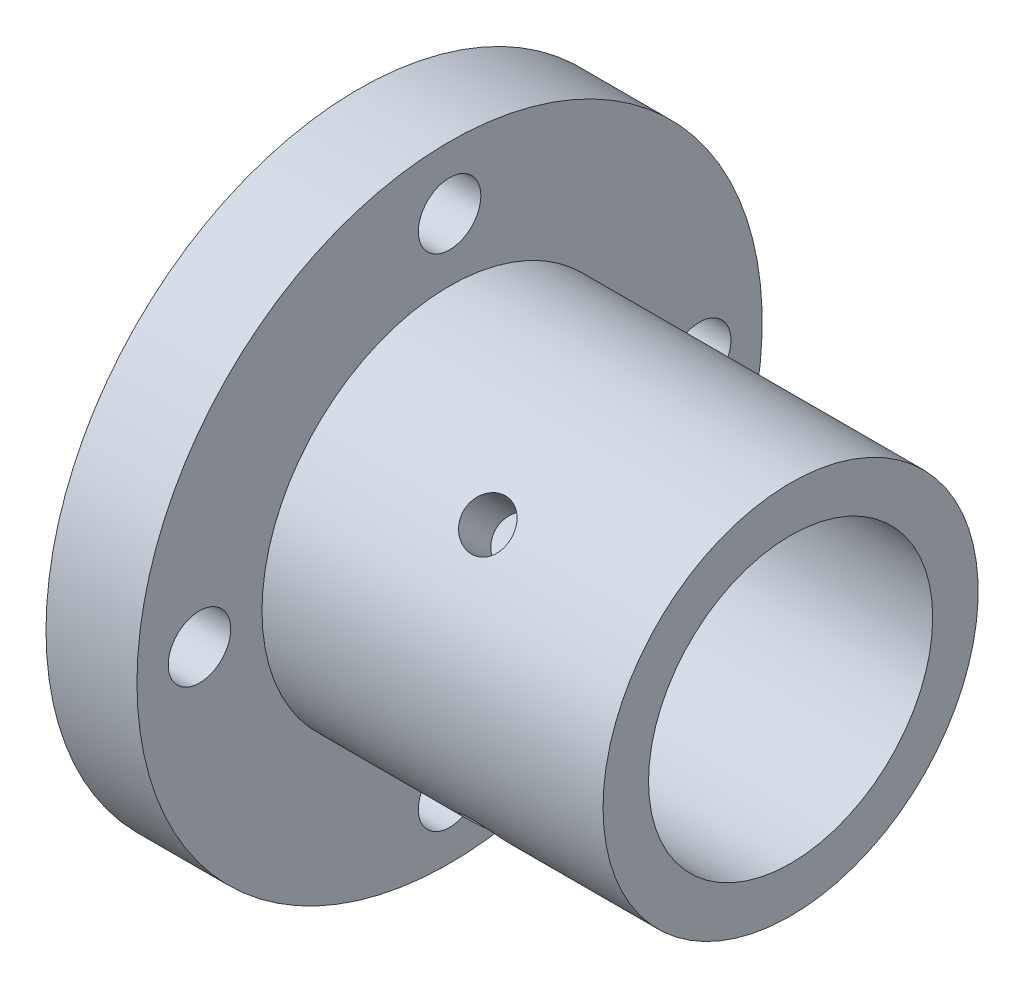
ISO-10303-21;
HEADER;
FILE_DESCRIPTION(('STEP AP214'),'2;1');
FILE_NAME('part.step','',(''),(''),'','','');
FILE_SCHEMA(('AUTOMOTIVE_DESIGN { 1 0 10303 214 1 1 1 1 }'));
ENDSEC;
DATA;
#1=APPLICATION_CONTEXT('core data for automotive mechanical design processes');
#2=APPLICATION_PROTOCOL_DEFINITION('international standard','automotive_design',2000,#1);
#3=PRODUCT_CONTEXT('',#1,'mechanical');
#4=PRODUCT('Part','Part','',(#3));
#5=PRODUCT_RELATED_PRODUCT_CATEGORY('part','',(#4));
#6=PRODUCT_DEFINITION_FORMATION('','',#4);
#7=PRODUCT_DEFINITION_CONTEXT('part definition',#1,'design');
#8=PRODUCT_DEFINITION('design','',#6,#7);
#9=PRODUCT_DEFINITION_SHAPE('','',#8);
#10=(LENGTH_UNIT() NAMED_UNIT(*) SI_UNIT(.MILLI.,.METRE.));
#11=(NAMED_UNIT(*) PLANE_ANGLE_UNIT() SI_UNIT($,.RADIAN.));
#12=(NAMED_UNIT(*) SI_UNIT($,.STERADIAN.) SOLID_ANGLE_UNIT());
#13=UNCERTAINTY_MEASURE_WITH_UNIT(LENGTH_MEASURE(1.E-05),#10,'distance_accuracy_value','');
#14=(GEOMETRIC_REPRESENTATION_CONTEXT(3) GLOBAL_UNCERTAINTY_ASSIGNED_CONTEXT((#13)) GLOBAL_UNIT_ASSIGNED_CONTEXT((#10,
#11,#12)) REPRESENTATION_CONTEXT('',''));
#15=CARTESIAN_POINT('',(0.,0.,0.));
#16=DIRECTION('',(0.,0.,1.));
#17=DIRECTION('',(1.,0.,0.));
#18=AXIS2_PLACEMENT_3D('',#15,#16,#17);
#19=CARTESIAN_POINT('',(8.,27.5,0.));
#20=DIRECTION('',(-1.,0.,0.));
#21=DIRECTION('',(0.,0.,1.));
#22=AXIS2_PLACEMENT_3D('',#19,#20,#21);
#23=PLANE('',#22);
#24=CARTESIAN_POINT('',(8.,0.,-22.));
#25=DIRECTION('',(1.,0.,0.));
#26=DIRECTION('',(0.,0.,-1.));
#27=AXIS2_PLACEMENT_3D('',#24,#25,#26);
#28=CIRCLE('',#27,2.75);
#29=CARTESIAN_POINT('',(8.,0.,-24.75));
#30=VERTEX_POINT('',#29);
#31=EDGE_CURVE('E181',#30,#30,#28,.T.);
#32=ORIENTED_EDGE('',*,*,#31,.F.);
#33=EDGE_LOOP('',(#32));
#34=FACE_BOUND('',#33,.T.);
#35=CARTESIAN_POINT('',(8.,22.,0.));
#36=DIRECTION('',(1.,0.,0.));
#37=DIRECTION('',(0.,0.,-1.));
#38=AXIS2_PLACEMENT_3D('',#35,#36,#37);
#39=CIRCLE('',#38,2.75);
#40=CARTESIAN_POINT('',(8.,22.,-2.75));
#41=VERTEX_POINT('',#40);
#42=EDGE_CURVE('E187',#41,#41,#39,.T.);
#43=ORIENTED_EDGE('',*,*,#42,.F.);
#44=EDGE_LOOP('',(#43));
#45=FACE_BOUND('',#44,.T.);
#46=CARTESIAN_POINT('',(8.,-22.,0.));
#47=DIRECTION('',(1.,0.,0.));
#48=DIRECTION('',(0.,0.,-1.));
#49=AXIS2_PLACEMENT_3D('',#46,#47,#48);
#50=CIRCLE('',#49,2.75);
#51=CARTESIAN_POINT('',(8.,-22.,-2.75));
#52=VERTEX_POINT('',#51);
#53=EDGE_CURVE('E142',#52,#52,#50,.T.);
#54=ORIENTED_EDGE('',*,*,#53,.F.);
#55=EDGE_LOOP('',(#54));
#56=FACE_BOUND('',#55,.T.);
#57=CARTESIAN_POINT('',(7.99999999999999,0.,0.));
#58=DIRECTION('',(-1.,0.,0.));
#59=DIRECTION('',(0.,0.,1.));
#60=AXIS2_PLACEMENT_3D('',#57,#58,#59);
#61=CIRCLE('',#60,27.5);
#62=CARTESIAN_POINT('',(7.99999999999999,0.,27.5));
#63=VERTEX_POINT('',#62);
#64=EDGE_CURVE('E57',#63,#63,#61,.T.);
#65=ORIENTED_EDGE('',*,*,#64,.F.);
#66=EDGE_LOOP('',(#65));
#67=FACE_BOUND('',#66,.T.);
#68=CARTESIAN_POINT('',(8.,0.,0.));
#69=DIRECTION('',(-1.,0.,0.));
#70=DIRECTION('',(0.,0.,1.));
#71=AXIS2_PLACEMENT_3D('',#68,#69,#70);
#72=CIRCLE('',#71,16.5);
#73=CARTESIAN_POINT('',(8.,0.,16.5));
#74=VERTEX_POINT('',#73);
#75=EDGE_CURVE('E61',#74,#74,#72,.T.);
#76=ORIENTED_EDGE('',*,*,#75,.T.);
#77=EDGE_LOOP('',(#76));
#78=FACE_BOUND('',#77,.T.);
#79=CARTESIAN_POINT('',(8.,0.,22.));
#80=DIRECTION('',(1.,0.,0.));
#81=DIRECTION('',(0.,0.,-1.));
#82=AXIS2_PLACEMENT_3D('',#79,#80,#81);
#83=CIRCLE('',#82,2.75);
#84=CARTESIAN_POINT('',(8.,0.,19.25));
#85=VERTEX_POINT('',#84);
#86=EDGE_CURVE('E178',#85,#85,#83,.T.);
#87=ORIENTED_EDGE('',*,*,#86,.F.);
#88=EDGE_LOOP('',(#87));
#89=FACE_BOUND('',#88,.T.);
#90=ADVANCED_FACE('F46',(#34,#45,#56,#67,#78,#89),#23,.F.);
#91=CARTESIAN_POINT('',(0.,0.,0.));
#92=DIRECTION('',(-1.,0.,0.));
#93=DIRECTION('',(0.,0.,1.));
#94=AXIS2_PLACEMENT_3D('',#91,#92,#93);
#95=CYLINDRICAL_SURFACE('',#94,12.5);
#96=CARTESIAN_POINT('',(23.,-10.1981326048085,7.22828412382502));
#97=CARTESIAN_POINT('',(23.1170613984795,-10.1981307886513,7.22828894439021));
#98=CARTESIAN_POINT('',(23.2341863798609,-10.1923802342487,7.23642113225539));
#99=CARTESIAN_POINT('',(23.4651490324188,-10.169440788203,7.2686209091172));
#100=CARTESIAN_POINT('',(23.5789835866218,-10.1522413993201,7.2927031223168));
#101=CARTESIAN_POINT('',(23.7999894591586,-10.1066463659208,7.35575981861834));
#102=CARTESIAN_POINT('',(23.9071662969402,-10.0782601429937,7.39472176910366));
#103=CARTESIAN_POINT('',(24.1119972720998,-10.0106771232393,7.48595696267677));
#104=CARTESIAN_POINT('',(24.2096524594021,-9.97148152015918,7.53822873582905));
#105=CARTESIAN_POINT('',(24.393657323366,-9.882425934325,7.65461033215918));
#106=CARTESIAN_POINT('',(24.4798978193338,-9.83247351229668,7.71882206404446));
#107=CARTESIAN_POINT('',(24.6376767535172,-9.72288925943752,7.85640784989948));
#108=CARTESIAN_POINT('',(24.7092143148789,-9.66325685169084,7.92978244990528));
#109=CARTESIAN_POINT('',(24.835966987701,-9.53497572844085,8.08358277969902));
#110=CARTESIAN_POINT('',(24.8910804057894,-9.46627449059911,8.16404859930772));
#111=CARTESIAN_POINT('',(24.9827665836649,-9.32157088286221,8.32888522787638));
#112=CARTESIAN_POINT('',(25.0193405681662,-9.24556899564229,8.41325577848803));
#113=CARTESIAN_POINT('',(25.072575520882,-9.08883315214333,8.58232303405472));
#114=CARTESIAN_POINT('',(25.0894199723059,-9.00815024308958,8.66700926462315));
#115=CARTESIAN_POINT('',(25.1032883318735,-8.84357818645449,8.83487040810208));
#116=CARTESIAN_POINT('',(25.1003136079088,-8.75968926054527,8.91804542491712));
#117=CARTESIAN_POINT('',(25.0747710060593,-8.59201984639649,9.07968199579344));
#118=CARTESIAN_POINT('',(25.0524005980241,-8.50824676209205,9.1581825592171));
#119=CARTESIAN_POINT('',(24.9890126695472,-8.34254271046818,9.3093807384565));
#120=CARTESIAN_POINT('',(24.9479945740585,-8.26061180003846,9.38207817523736));
#121=CARTESIAN_POINT('',(24.8482798677082,-8.10085139957571,9.52036934670341));
#122=CARTESIAN_POINT('',(24.7895020362658,-8.02304272525901,9.58592852116968));
#123=CARTESIAN_POINT('',(24.655995870961,-7.87454367489341,9.7082868465584));
#124=CARTESIAN_POINT('',(24.5812662259142,-7.80385388469569,9.76508527671632));
#125=CARTESIAN_POINT('',(24.4168829140222,-7.67124814220185,9.86960898324088));
#126=CARTESIAN_POINT('',(24.327056646426,-7.60945107691787,9.91721379374904));
#127=CARTESIAN_POINT('',(24.1356110841336,-7.49800424460658,10.0017418444876));
#128=CARTESIAN_POINT('',(24.0339916772532,-7.44835459314769,10.038664983095));
#129=CARTESIAN_POINT('',(23.8216464453553,-7.3631271811199,10.1013451382225));
#130=CARTESIAN_POINT('',(23.710910267532,-7.32756569257743,10.1270892460825));
#131=CARTESIAN_POINT('',(23.4835851454842,-7.2721007636902,10.1669921421692));
#132=CARTESIAN_POINT('',(23.3669967263997,-7.25219592108774,10.1811519679247));
#133=CARTESIAN_POINT('',(23.1327916780163,-7.22905723384539,10.1975944857706));
#134=CARTESIAN_POINT('',(23.0152046873147,-7.22562404858701,10.2000191997902));
#135=CARTESIAN_POINT('',(22.7810176456507,-7.23503755010784,10.1933440874258));
#136=CARTESIAN_POINT('',(22.6644175561098,-7.24788359753837,10.1842447136375));
#137=CARTESIAN_POINT('',(22.4362825493482,-7.28916093488283,10.1547409151728));
#138=CARTESIAN_POINT('',(22.3247198496611,-7.31749132933072,10.1344096678628));
#139=CARTESIAN_POINT('',(22.1089442159606,-7.38849304971209,10.0827618321064));
#140=CARTESIAN_POINT('',(22.0047317284302,-7.43116524592106,10.0514445770127));
#141=CARTESIAN_POINT('',(21.805541110434,-7.52962945134889,9.97789944844883));
#142=CARTESIAN_POINT('',(21.7106586041627,-7.58554059027008,9.93557213935256));
#143=CARTESIAN_POINT('',(21.5338103978566,-7.70814451988606,9.84075703863453));
#144=CARTESIAN_POINT('',(21.4518456223042,-7.77483808155444,9.78826852040468));
#145=CARTESIAN_POINT('',(21.3022768969961,-7.91736231626032,9.67335646977207));
#146=CARTESIAN_POINT('',(21.2348340054259,-7.99328216848431,9.61083373000827));
#147=CARTESIAN_POINT('',(21.1173521496442,-8.15101580153728,9.47742556884917));
#148=CARTESIAN_POINT('',(21.0673126155126,-8.23282938925396,9.4065404214054));
#149=CARTESIAN_POINT('',(20.9863079657756,-8.39920887884043,9.25827416088997));
#150=CARTESIAN_POINT('',(20.955258885335,-8.48376089886334,9.18092338710197));
#151=CARTESIAN_POINT('',(20.9128462840786,-8.6532257910783,9.02137556636279));
#152=CARTESIAN_POINT('',(20.9014811163435,-8.73813863248505,8.93917892545208));
#153=CARTESIAN_POINT('',(20.8988069529719,-8.90469884311415,8.77325421757246));
#154=CARTESIAN_POINT('',(20.9072530135796,-8.98637352953092,8.68955741769242));
#155=CARTESIAN_POINT('',(20.9434313472036,-9.14529930315565,8.52213745204472));
#156=CARTESIAN_POINT('',(20.9711635079681,-9.22255041610751,8.43841428643336));
#157=CARTESIAN_POINT('',(21.0450322588923,-9.37063901207321,8.27365640748477));
#158=CARTESIAN_POINT('',(21.0911477011268,-9.44148375041511,8.19261872042888));
#159=CARTESIAN_POINT('',(21.2004465722753,-9.57534429793883,8.03575923257141));
#160=CARTESIAN_POINT('',(21.2636308312426,-9.63835972616518,7.95993768565477));
#161=CARTESIAN_POINT('',(21.4061405861386,-9.75607884740122,7.81522487742565));
#162=CARTESIAN_POINT('',(21.4856453082066,-9.81067731856278,7.74642450015062));
#163=CARTESIAN_POINT('',(21.6581632499166,-9.90978488031153,7.61923105603618));
#164=CARTESIAN_POINT('',(21.751179629318,-9.95429160464808,7.56084043069592));
#165=CARTESIAN_POINT('',(21.9488762015525,-10.0328280900646,7.45631797960671));
#166=CARTESIAN_POINT('',(22.0536355573304,-10.0667801039038,7.4102774511091));
#167=CARTESIAN_POINT('',(22.2712703667515,-10.123266824564,7.33292454113278));
#168=CARTESIAN_POINT('',(22.38413761003,-10.1458129004363,7.30159749599369));
#169=CARTESIAN_POINT('',(22.5811985126134,-10.1743630253965,7.26173086402306));
#170=CARTESIAN_POINT('',(22.6642012225838,-10.1832694655342,7.24921574895908));
#171=CARTESIAN_POINT('',(22.8314583160049,-10.1951548538376,7.23249072079573));
#172=CARTESIAN_POINT('',(22.9157126760953,-10.1981339124901,7.22828065288972));
#173=CARTESIAN_POINT('',(23.,-10.1981326048085,7.22828412382502));
#174=B_SPLINE_CURVE_WITH_KNOTS('',3,(#96,#97,#98,#99,#100,#101,#102,#103,#104,#105,#106,#107,
#108,#109,#110,#111,#112,#113,#114,#115,#116,#117,#118,#119,#120,#121,#122,#123,#124,#125,#126,
#127,#128,#129,#130,#131,#132,#133,#134,#135,#136,#137,#138,#139,#140,#141,#142,#143,#144,#145,
#146,#147,#148,#149,#150,#151,#152,#153,#154,#155,#156,#157,#158,#159,#160,#161,#162,#163,#164,
#165,#166,#167,#168,#169,#170,#171,#172,#173),.UNSPECIFIED.,.T.,.F.,(4,2,2,2,2,2,2,2,2,2,2,2,2,
2,2,2,2,2,2,2,2,2,2,2,2,2,2,2,2,2,2,2,2,2,2,2,2,2,4),(0.,0.350875958145451,0.702074072387613,
1.05297703633846,1.40384126339609,1.75785040037218,2.11188064363101,2.46805944490096,
2.82421471394629,3.17703078298167,3.52982250139846,3.87906402811644,4.22831632528106,
4.57919067492619,4.93009387634909,5.28532233621946,5.64055417554106,5.99619512469853,
6.35180421792334,6.70309867118227,7.05437932817152,7.4033978775084,7.75243760948005,
8.10474624423454,8.45708008119898,8.81314042381343,9.16918910516888,9.52365194445036,
9.87808512500237,10.2281592743139,10.5782313860894,10.927901935583,11.2775894925505,
11.6313450994484,11.9851835672062,12.3415698589654,12.6976002135917,12.950244955607,
13.2028849882627),.UNSPECIFIED.);
#175=CARTESIAN_POINT('',(23.,-10.1981326048085,7.22828412382502));
#176=VERTEX_POINT('',#175);
#177=EDGE_CURVE('E141',#176,#176,#174,.T.);
#178=ORIENTED_EDGE('',*,*,#177,.T.);
#179=EDGE_LOOP('',(#178));
#180=FACE_BOUND('',#179,.T.);
#181=CARTESIAN_POINT('',(23.,7.22828412382505,10.1981326048085));
#182=CARTESIAN_POINT('',(23.1170613984795,7.22828894439024,10.1981307886513));
#183=CARTESIAN_POINT('',(23.2341863798609,7.23642113225543,10.1923802342487));
#184=CARTESIAN_POINT('',(23.4651490324188,7.26862090911723,10.169440788203));
#185=CARTESIAN_POINT('',(23.5789835866218,7.29270312231683,10.15224139932));
#186=CARTESIAN_POINT('',(23.7999894591586,7.35575981861837,10.1066463659207));
#187=CARTESIAN_POINT('',(23.9071662969402,7.39472176910369,10.0782601429937));
#188=CARTESIAN_POINT('',(24.1119972720998,7.4859569626768,10.0106771232393));
#189=CARTESIAN_POINT('',(24.2096524594021,7.53822873582908,9.97148152015916));
#190=CARTESIAN_POINT('',(24.393657323366,7.65461033215921,9.88242593432497));
#191=CARTESIAN_POINT('',(24.4798978193338,7.7188220640445,9.83247351229665));
#192=CARTESIAN_POINT('',(24.6376767535172,7.85640784989951,9.7228892594375));
#193=CARTESIAN_POINT('',(24.7092143148789,7.92978244990532,9.66325685169082));
#194=CARTESIAN_POINT('',(24.835966987701,8.08358277969905,9.53497572844083));
#195=CARTESIAN_POINT('',(24.8910804057894,8.16404859930775,9.46627449059909));
#196=CARTESIAN_POINT('',(24.9827665836649,8.32888522787641,9.32157088286218));
#197=CARTESIAN_POINT('',(25.0193405681662,8.41325577848806,9.24556899564227));
#198=CARTESIAN_POINT('',(25.072575520882,8.58232303405475,9.0888331521433));
#199=CARTESIAN_POINT('',(25.0894199723059,8.66700926462317,9.00815024308955));
#200=CARTESIAN_POINT('',(25.1032883318735,8.8348704081021,8.84357818645446));
#201=CARTESIAN_POINT('',(25.1003136079088,8.91804542491715,8.75968926054525));
#202=CARTESIAN_POINT('',(25.0747710060593,9.07968199579347,8.59201984639646));
#203=CARTESIAN_POINT('',(25.0524005980241,9.15818255921713,8.50824676209202));
#204=CARTESIAN_POINT('',(24.9890126695472,9.30938073845652,8.34254271046815));
#205=CARTESIAN_POINT('',(24.9479945740585,9.38207817523738,8.26061180003843));
#206=CARTESIAN_POINT('',(24.8482798677082,9.52036934670344,8.10085139957569));
#207=CARTESIAN_POINT('',(24.7895020362658,9.5859285211697,8.02304272525898));
#208=CARTESIAN_POINT('',(24.655995870961,9.70828684655843,7.87454367489338));
#209=CARTESIAN_POINT('',(24.5812662259142,9.76508527671634,7.80385388469566));
#210=CARTESIAN_POINT('',(24.4168829140222,9.86960898324091,7.67124814220182));
#211=CARTESIAN_POINT('',(24.327056646426,9.91721379374906,7.60945107691784));
#212=CARTESIAN_POINT('',(24.1356110841336,10.0017418444876,7.49800424460655));
#213=CARTESIAN_POINT('',(24.0339916772532,10.038664983095,7.44835459314765));
#214=CARTESIAN_POINT('',(23.8216464453553,10.1013451382225,7.36312718111986));
#215=CARTESIAN_POINT('',(23.710910267532,10.1270892460825,7.3275656925774));
#216=CARTESIAN_POINT('',(23.4835851454842,10.1669921421692,7.27210076369016));
#217=CARTESIAN_POINT('',(23.3669967263997,10.1811519679247,7.25219592108771));
#218=CARTESIAN_POINT('',(23.1327916780163,10.1975944857706,7.22905723384535));
#219=CARTESIAN_POINT('',(23.0152046873148,10.2000191997902,7.22562404858698));
#220=CARTESIAN_POINT('',(22.7810176456507,10.1933440874258,7.23503755010781));
#221=CARTESIAN_POINT('',(22.6644175561098,10.1842447136375,7.24788359753833));
#222=CARTESIAN_POINT('',(22.4362825493482,10.1547409151728,7.28916093488279));
#223=CARTESIAN_POINT('',(22.3247198496611,10.1344096678628,7.31749132933068));
#224=CARTESIAN_POINT('',(22.1089442159606,10.0827618321065,7.38849304971205));
#225=CARTESIAN_POINT('',(22.0047317284302,10.0514445770127,7.43116524592102));
#226=CARTESIAN_POINT('',(21.805541110434,9.97789944844886,7.52962945134885));
#227=CARTESIAN_POINT('',(21.7106586041627,9.93557213935259,7.58554059027005));
#228=CARTESIAN_POINT('',(21.5338103978566,9.84075703863456,7.70814451988603));
#229=CARTESIAN_POINT('',(21.4518456223042,9.78826852040471,7.7748380815544));
#230=CARTESIAN_POINT('',(21.3022768969961,9.6733564697721,7.91736231626028));
#231=CARTESIAN_POINT('',(21.2348340054259,9.6108337300083,7.99328216848428));
#232=CARTESIAN_POINT('',(21.1173521496442,9.4774255688492,8.15101580153724));
#233=CARTESIAN_POINT('',(21.0673126155126,9.40654042140543,8.23282938925393));
#234=CARTESIAN_POINT('',(20.9863079657756,9.25827416089001,8.3992088788404));
#235=CARTESIAN_POINT('',(20.955258885335,9.180923387102,8.48376089886331));
#236=CARTESIAN_POINT('',(20.9128462840786,9.02137556636282,8.65322579107826));
#237=CARTESIAN_POINT('',(20.9014811163435,8.93917892545211,8.73813863248501));
#238=CARTESIAN_POINT('',(20.8988069529719,8.77325421757249,8.90469884311412));
#239=CARTESIAN_POINT('',(20.9072530135796,8.68955741769246,8.98637352953089));
#240=CARTESIAN_POINT('',(20.9434313472036,8.52213745204476,9.14529930315562));
#241=CARTESIAN_POINT('',(20.9711635079681,8.43841428643339,9.22255041610748));
#242=CARTESIAN_POINT('',(21.0450322588923,8.2736564074848,9.37063901207318));
#243=CARTESIAN_POINT('',(21.0911477011268,8.19261872042891,9.44148375041508));
#244=CARTESIAN_POINT('',(21.2004465722753,8.03575923257144,9.5753442979388));
#245=CARTESIAN_POINT('',(21.2636308312426,7.9599376856548,9.63835972616515));
#246=CARTESIAN_POINT('',(21.4061405861386,7.81522487742569,9.75607884740119));
#247=CARTESIAN_POINT('',(21.4856453082066,7.74642450015066,9.81067731856275));
#248=CARTESIAN_POINT('',(21.6581632499165,7.61923105603622,9.9097848803115));
#249=CARTESIAN_POINT('',(21.751179629318,7.56084043069596,9.95429160464805));
#250=CARTESIAN_POINT('',(21.9488762015525,7.45631797960674,10.0328280900646));
#251=CARTESIAN_POINT('',(22.0536355573304,7.41027745110913,10.0667801039037));
#252=CARTESIAN_POINT('',(22.2712703667515,7.33292454113281,10.123266824564));
#253=CARTESIAN_POINT('',(22.38413761003,7.30159749599373,10.1458129004362));
#254=CARTESIAN_POINT('',(22.5811985126134,7.26173086402309,10.1743630253964));
#255=CARTESIAN_POINT('',(22.6642012225838,7.24921574895912,10.1832694655341));
#256=CARTESIAN_POINT('',(22.8314583160049,7.23249072079577,10.1951548538376));
#257=CARTESIAN_POINT('',(22.9157126760953,7.22828065288976,10.1981339124901));
#258=CARTESIAN_POINT('',(23.,7.22828412382505,10.1981326048085));
#259=B_SPLINE_CURVE_WITH_KNOTS('',3,(#181,#182,#183,#184,#185,#186,#187,#188,#189,#190,#191,
#192,#193,#194,#195,#196,#197,#198,#199,#200,#201,#202,#203,#204,#205,#206,#207,#208,#209,#210,
#211,#212,#213,#214,#215,#216,#217,#218,#219,#220,#221,#222,#223,#224,#225,#226,#227,#228,#229,
#230,#231,#232,#233,#234,#235,#236,#237,#238,#239,#240,#241,#242,#243,#244,#245,#246,#247,#248,
#249,#250,#251,#252,#253,#254,#255,#256,#257,#258),.UNSPECIFIED.,.T.,.F.,(4,2,2,2,2,2,2,2,2,2,2,
2,2,2,2,2,2,2,2,2,2,2,2,2,2,2,2,2,2,2,2,2,2,2,2,2,2,2,4),(0.,0.350875958145451,0.70207407238761,
1.05297703633845,1.40384126339608,1.75785040037217,2.11188064363101,2.46805944490095,
2.82421471394628,3.17703078298166,3.52982250139846,3.87906402811643,4.22831632528105,
4.57919067492618,4.93009387634908,5.28532233621946,5.64055417554105,5.99619512469852,
6.35180421792333,6.70309867118225,7.05437932817151,7.40339787750839,7.75243760948003,
8.10474624423453,8.45708008119897,8.81314042381342,9.16918910516887,9.52365194445034,
9.87808512500236,10.2281592743139,10.5782313860894,10.927901935583,11.2775894925505,
11.6313450994484,11.9851835672061,12.3415698589654,12.6976002135917,12.950244955607,
13.2028849882627),.UNSPECIFIED.);
#260=CARTESIAN_POINT('',(23.,7.22828412382505,10.1981326048085));
#261=VERTEX_POINT('',#260);
#262=EDGE_CURVE('E79',#261,#261,#259,.T.);
#263=ORIENTED_EDGE('',*,*,#262,.T.);
#264=EDGE_LOOP('',(#263));
#265=FACE_BOUND('',#264,.T.);
#266=CARTESIAN_POINT('',(38.,0.,0.));
#267=DIRECTION('',(-1.,0.,0.));
#268=DIRECTION('',(0.,0.,1.));
#269=AXIS2_PLACEMENT_3D('',#266,#267,#268);
#270=CIRCLE('',#269,12.5);
#271=CARTESIAN_POINT('',(38.,0.,12.5));
#272=VERTEX_POINT('',#271);
#273=EDGE_CURVE('E69',#272,#272,#270,.T.);
#274=ORIENTED_EDGE('',*,*,#273,.F.);
#275=EDGE_LOOP('',(#274));
#276=FACE_BOUND('',#275,.T.);
#277=CARTESIAN_POINT('',(0.,0.,0.));
#278=DIRECTION('',(-1.,0.,0.));
#279=DIRECTION('',(0.,0.,1.));
#280=AXIS2_PLACEMENT_3D('',#277,#278,#279);
#281=CIRCLE('',#280,12.5);
#282=CARTESIAN_POINT('',(0.,0.,12.5));
#283=VERTEX_POINT('',#282);
#284=EDGE_CURVE('E12',#283,#283,#281,.T.);
#285=ORIENTED_EDGE('',*,*,#284,.T.);
#286=EDGE_LOOP('',(#285));
#287=FACE_BOUND('',#286,.T.);
#288=ADVANCED_FACE('F48',(#180,#265,#276,#287),#95,.F.);
#289=CARTESIAN_POINT('',(0.,12.5,0.));
#290=DIRECTION('',(1.,0.,0.));
#291=DIRECTION('',(0.,0.,-1.));
#292=AXIS2_PLACEMENT_3D('',#289,#290,#291);
#293=PLANE('',#292);
#294=CARTESIAN_POINT('',(0.,0.,22.));
#295=DIRECTION('',(1.,0.,0.));
#296=DIRECTION('',(0.,0.,-1.));
#297=AXIS2_PLACEMENT_3D('',#294,#295,#296);
#298=CIRCLE('',#297,2.75);
#299=CARTESIAN_POINT('',(0.,0.,19.25));
#300=VERTEX_POINT('',#299);
#301=EDGE_CURVE('E127',#300,#300,#298,.T.);
#302=ORIENTED_EDGE('',*,*,#301,.T.);
#303=EDGE_LOOP('',(#302));
#304=FACE_BOUND('',#303,.T.);
#305=CARTESIAN_POINT('',(0.,0.,-22.));
#306=DIRECTION('',(1.,0.,0.));
#307=DIRECTION('',(0.,0.,-1.));
#308=AXIS2_PLACEMENT_3D('',#305,#306,#307);
#309=CIRCLE('',#308,2.75);
#310=CARTESIAN_POINT('',(0.,0.,-24.75));
#311=VERTEX_POINT('',#310);
#312=EDGE_CURVE('E131',#311,#311,#309,.T.);
#313=ORIENTED_EDGE('',*,*,#312,.T.);
#314=EDGE_LOOP('',(#313));
#315=FACE_BOUND('',#314,.T.);
#316=CARTESIAN_POINT('',(0.,22.,0.));
#317=DIRECTION('',(1.,0.,0.));
#318=DIRECTION('',(0.,0.,-1.));
#319=AXIS2_PLACEMENT_3D('',#316,#317,#318);
#320=CIRCLE('',#319,2.75);
#321=CARTESIAN_POINT('',(0.,22.,-2.75));
#322=VERTEX_POINT('',#321);
#323=EDGE_CURVE('E135',#322,#322,#320,.T.);
#324=ORIENTED_EDGE('',*,*,#323,.T.);
#325=EDGE_LOOP('',(#324));
#326=FACE_BOUND('',#325,.T.);
#327=CARTESIAN_POINT('',(0.,-22.,0.));
#328=DIRECTION('',(1.,0.,0.));
#329=DIRECTION('',(0.,0.,-1.));
#330=AXIS2_PLACEMENT_3D('',#327,#328,#329);
#331=CIRCLE('',#330,2.75);
#332=CARTESIAN_POINT('',(0.,-22.,-2.75));
#333=VERTEX_POINT('',#332);
#334=EDGE_CURVE('E139',#333,#333,#331,.T.);
#335=ORIENTED_EDGE('',*,*,#334,.T.);
#336=EDGE_LOOP('',(#335));
#337=FACE_BOUND('',#336,.T.);
#338=ORIENTED_EDGE('',*,*,#284,.F.);
#339=EDGE_LOOP('',(#338));
#340=FACE_BOUND('',#339,.T.);
#341=CARTESIAN_POINT('',(0.,0.,0.));
#342=DIRECTION('',(-1.,0.,0.));
#343=DIRECTION('',(0.,0.,1.));
#344=AXIS2_PLACEMENT_3D('',#341,#342,#343);
#345=CIRCLE('',#344,27.5);
#346=CARTESIAN_POINT('',(0.,0.,27.5));
#347=VERTEX_POINT('',#346);
#348=EDGE_CURVE('E53',#347,#347,#345,.T.);
#349=ORIENTED_EDGE('',*,*,#348,.T.);
#350=EDGE_LOOP('',(#349));
#351=FACE_BOUND('',#350,.T.);
#352=ADVANCED_FACE('F113',(#304,#315,#326,#337,#340,#351),#293,.F.);
#353=CARTESIAN_POINT('',(0.,0.,0.));
#354=DIRECTION('',(-1.,0.,0.));
#355=DIRECTION('',(0.,0.,1.));
#356=AXIS2_PLACEMENT_3D('',#353,#354,#355);
#357=CYLINDRICAL_SURFACE('',#356,27.5);
#358=ORIENTED_EDGE('',*,*,#348,.F.);
#359=EDGE_LOOP('',(#358));
#360=FACE_BOUND('',#359,.T.);
#361=ORIENTED_EDGE('',*,*,#64,.T.);
#362=EDGE_LOOP('',(#361));
#363=FACE_BOUND('',#362,.T.);
#364=ADVANCED_FACE('F104',(#360,#363),#357,.T.);
#365=CARTESIAN_POINT('',(0.,0.,0.));
#366=DIRECTION('',(-1.,0.,0.));
#367=DIRECTION('',(0.,0.,1.));
#368=AXIS2_PLACEMENT_3D('',#365,#366,#367);
#369=CYLINDRICAL_SURFACE('',#368,16.5);
#370=CARTESIAN_POINT('',(23.,-13.0573051536833,10.0874566726998));
#371=CARTESIAN_POINT('',(22.8825557424815,-13.0573028422381,10.087461407512));
#372=CARTESIAN_POINT('',(22.7650385172695,-13.0512186277254,10.0953503597427));
#373=CARTESIAN_POINT('',(22.53327585172,-13.0269692580387,10.1266207747188));
#374=CARTESIAN_POINT('',(22.4190339400822,-13.0087915489158,10.1500183364635));
#375=CARTESIAN_POINT('',(22.1972109297717,-12.9606784248516,10.2113821383116));
#376=CARTESIAN_POINT('',(22.0896253197096,-12.9307510767027,10.2493383826443));
#377=CARTESIAN_POINT('',(21.8840558858182,-12.8596681729312,10.3383830778541));
#378=CARTESIAN_POINT('',(21.7860704511915,-12.8185145053542,10.3894693204408));
#379=CARTESIAN_POINT('',(21.6018951435969,-12.7254744907728,10.5032238077365));
#380=CARTESIAN_POINT('',(21.5157689785571,-12.673533670654,10.5659506572393));
#381=CARTESIAN_POINT('',(21.3583074766971,-12.5600423714483,10.7006108922044));
#382=CARTESIAN_POINT('',(21.2869728819696,-12.4984914104923,10.772544739289));
#383=CARTESIAN_POINT('',(21.1608903395997,-12.3668270189787,10.9234442774052));
#384=CARTESIAN_POINT('',(21.1062001401415,-12.2966849353112,11.0024332477768));
#385=CARTESIAN_POINT('',(21.0153287835502,-12.1496125187718,11.1646265660648));
#386=CARTESIAN_POINT('',(20.9791469153102,-12.0726824468336,11.2478307518939));
#387=CARTESIAN_POINT('',(20.9265098890919,-11.9143998905878,11.4153526388263));
#388=CARTESIAN_POINT('',(20.909948736006,-11.83307367354,11.4996618459192));
#389=CARTESIAN_POINT('',(20.8966947038146,-11.6678268803001,11.6672903308105));
#390=CARTESIAN_POINT('',(20.9000010160627,-11.5839064098378,11.750609648761));
#391=CARTESIAN_POINT('',(20.9263032228384,-11.4163958748683,11.9134156893745));
#392=CARTESIAN_POINT('',(20.9491851190209,-11.332806706927,11.9929217928134));
#393=CARTESIAN_POINT('',(21.0138106961442,-11.1680002568321,12.1465414568452));
#394=CARTESIAN_POINT('',(21.0555547467348,-11.0867830211955,12.220654911723));
#395=CARTESIAN_POINT('',(21.1568405209778,-10.9290576178263,12.3619153589769));
#396=CARTESIAN_POINT('',(21.2164314656144,-10.8525631883934,12.4290423840553));
#397=CARTESIAN_POINT('',(21.3516836429658,-10.7070295137392,12.5546315356235));
#398=CARTESIAN_POINT('',(21.4273456396326,-10.6379906231592,12.6130932499754));
#399=CARTESIAN_POINT('',(21.5932303570148,-10.5092514137912,12.720563312017));
#400=CARTESIAN_POINT('',(21.6835524438799,-10.4496207254482,12.7695017468886));
#401=CARTESIAN_POINT('',(21.8758523988917,-10.3424208269031,12.8564813190752));
#402=CARTESIAN_POINT('',(21.9778303060326,-10.2948516570542,12.894522419932));
#403=CARTESIAN_POINT('',(22.1906362909102,-10.2135249009041,12.9590361546607));
#404=CARTESIAN_POINT('',(22.3014683320833,-10.1797735418372,12.9855035730184));
#405=CARTESIAN_POINT('',(22.5287899453637,-10.1274218036341,13.026374814074));
#406=CARTESIAN_POINT('',(22.6452792341424,-10.108820666566,13.0407792402575));
#407=CARTESIAN_POINT('',(22.8797366369799,-10.0875822480261,13.0572151132725));
#408=CARTESIAN_POINT('',(22.9976887181186,-10.0848342665651,13.0593323600857));
#409=CARTESIAN_POINT('',(23.2324875652892,-10.0951146236296,13.0513869486261));
#410=CARTESIAN_POINT('',(23.3493343557098,-10.1081426132292,13.0413245597368));
#411=CARTESIAN_POINT('',(23.5781882047579,-10.1493859697713,13.0092519363262));
#412=CARTESIAN_POINT('',(23.6902107891035,-10.1775479527971,12.9872836964141));
#413=CARTESIAN_POINT('',(23.9067223517261,-10.2479450920465,12.9318064475647));
#414=CARTESIAN_POINT('',(24.0112110559766,-10.2901807598526,12.8982970191004));
#415=CARTESIAN_POINT('',(24.2103169628249,-10.3874294772785,12.8201095185758));
#416=CARTESIAN_POINT('',(24.3048770404573,-10.4425111570745,12.7753713552403));
#417=CARTESIAN_POINT('',(24.4808582533848,-10.5633481982066,12.6756379126368));
#418=CARTESIAN_POINT('',(24.5622788582134,-10.6291039902626,12.6206422194452));
#419=CARTESIAN_POINT('',(24.7101589017694,-10.7694370026167,12.5011101771876));
#420=CARTESIAN_POINT('',(24.7765269727688,-10.844064113046,12.4365193060304));
#421=CARTESIAN_POINT('',(24.8917854319296,-10.9993101755405,12.2994261922496));
#422=CARTESIAN_POINT('',(24.9406761833874,-11.0799290030154,12.2269241141149));
#423=CARTESIAN_POINT('',(25.0194417031344,-11.2443040950887,12.0759279147478));
#424=CARTESIAN_POINT('',(25.0493690363537,-11.3280509995687,11.9974510384513));
#425=CARTESIAN_POINT('',(25.0895291229931,-11.4962746954627,11.8363517753805));
#426=CARTESIAN_POINT('',(25.099762798772,-11.5807514525076,11.7537295829392));
#427=CARTESIAN_POINT('',(25.1002273969265,-11.7473278210904,11.5872369367413));
#428=CARTESIAN_POINT('',(25.0905991118691,-11.829440009611,11.5033794240174));
#429=CARTESIAN_POINT('',(25.0519115920381,-11.9896412093083,11.3363090565004));
#430=CARTESIAN_POINT('',(25.0228523742855,-12.067730224009,11.2530962011426));
#431=CARTESIAN_POINT('',(24.9461725804011,-12.2178680046509,11.0899053579504));
#432=CARTESIAN_POINT('',(24.8985590041088,-12.2899190360483,11.009926162726));
#433=CARTESIAN_POINT('',(24.786136667238,-12.4263440604367,10.8557167171783));
#434=CARTESIAN_POINT('',(24.7213276719183,-12.4907179486067,10.7814865453548));
#435=CARTESIAN_POINT('',(24.5758341989341,-12.610838042339,10.6407422701485));
#436=CARTESIAN_POINT('',(24.4950450110241,-12.6665227590647,10.574283925153));
#437=CARTESIAN_POINT('',(24.3201023875749,-12.7676519194355,10.4519558345558));
#438=CARTESIAN_POINT('',(24.225945794229,-12.8130939368465,10.3960885982145));
#439=CARTESIAN_POINT('',(24.0265077275249,-12.8930420146966,10.2967742924295));
#440=CARTESIAN_POINT('',(23.9211832386276,-12.9275035796953,10.2533778254741));
#441=CARTESIAN_POINT('',(23.7027614914563,-12.984595332528,10.1809836775108));
#442=CARTESIAN_POINT('',(23.5896728065247,-13.0072383401944,10.151970396488));
#443=CARTESIAN_POINT('',(23.3966707917974,-13.0349338902686,10.1163635179567));
#444=CARTESIAN_POINT('',(23.3179729186899,-13.0433153505385,10.1055434852238));
#445=CARTESIAN_POINT('',(23.1595279153353,-13.0545017450844,10.0910884830695));
#446=CARTESIAN_POINT('',(23.0797807934674,-13.0573067238659,10.0874534563052));
#447=CARTESIAN_POINT('',(23.,-13.0573051536833,10.0874566726998));
#448=B_SPLINE_CURVE_WITH_KNOTS('',3,(#370,#371,#372,#373,#374,#375,#376,#377,#378,#379,#380,
#381,#382,#383,#384,#385,#386,#387,#388,#389,#390,#391,#392,#393,#394,#395,#396,#397,#398,#399,
#400,#401,#402,#403,#404,#405,#406,#407,#408,#409,#410,#411,#412,#413,#414,#415,#416,#417,#418,
#419,#420,#421,#422,#423,#424,#425,#426,#427,#428,#429,#430,#431,#432,#433,#434,#435,#436,#437,
#438,#439,#440,#441,#442,#443,#444,#445,#446,#447),.UNSPECIFIED.,.T.,.F.,(4,2,2,2,2,2,2,2,2,2,2,
2,2,2,2,2,2,2,2,2,2,2,2,2,2,2,2,2,2,2,2,2,2,2,2,2,2,2,4),(0.,0.352041307433846,0.70444863139133,
1.05661442968008,1.40872103709716,1.7626509447503,2.1165986047639,2.47176065224137,
2.8269090530479,3.1801299920053,3.53333655424597,3.88450011262202,4.23567055320159,
4.587818568442,4.93998332710414,5.29464321073411,5.64930428090487,6.00412500971586,
6.35892798654839,6.71125040499571,7.06356503107773,7.4146449763329,7.76573768483567,
8.11875091683685,8.47177839711733,8.82689456144455,9.18200334363917,9.53612343917083,
9.89022694897151,10.2418290042036,10.5934307514414,10.9448999811974,11.2963740092385,
11.650232288385,12.0041742996465,12.3595328476372,12.7145051255949,12.9536514201032,
13.1927958059915),.UNSPECIFIED.);
#449=CARTESIAN_POINT('',(23.,-13.0573051536833,10.0874566726998));
#450=VERTEX_POINT('',#449);
#451=EDGE_CURVE('E145',#450,#450,#448,.T.);
#452=ORIENTED_EDGE('',*,*,#451,.T.);
#453=EDGE_LOOP('',(#452));
#454=FACE_BOUND('',#453,.T.);
#455=CARTESIAN_POINT('',(23.,10.0874566726998,13.0573051536833));
#456=CARTESIAN_POINT('',(22.8825557424815,10.087461407512,13.0573028422381));
#457=CARTESIAN_POINT('',(22.7650385172695,10.0953503597427,13.0512186277254));
#458=CARTESIAN_POINT('',(22.53327585172,10.1266207747189,13.0269692580386));
#459=CARTESIAN_POINT('',(22.4190339400822,10.1500183364636,13.0087915489157));
#460=CARTESIAN_POINT('',(22.1972109297717,10.2113821383117,12.9606784248515));
#461=CARTESIAN_POINT('',(22.0896253197096,10.2493383826444,12.9307510767027));
#462=CARTESIAN_POINT('',(21.8840558858183,10.3383830778542,12.8596681729312));
#463=CARTESIAN_POINT('',(21.7860704511915,10.3894693204409,12.8185145053541));
#464=CARTESIAN_POINT('',(21.6018951435969,10.5032238077365,12.7254744907727));
#465=CARTESIAN_POINT('',(21.5157689785571,10.5659506572393,12.673533670654));
#466=CARTESIAN_POINT('',(21.3583074766971,10.7006108922045,12.5600423714483));
#467=CARTESIAN_POINT('',(21.2869728819696,10.7725447392891,12.4984914104922));
#468=CARTESIAN_POINT('',(21.1608903395997,10.9234442774053,12.3668270189787));
#469=CARTESIAN_POINT('',(21.1062001401415,11.0024332477768,12.2966849353112));
#470=CARTESIAN_POINT('',(21.0153287835502,11.1646265660649,12.1496125187717));
#471=CARTESIAN_POINT('',(20.9791469153102,11.2478307518939,12.0726824468336));
#472=CARTESIAN_POINT('',(20.9265098890919,11.4153526388263,11.9143998905878));
#473=CARTESIAN_POINT('',(20.909948736006,11.4996618459193,11.8330736735399));
#474=CARTESIAN_POINT('',(20.8966947038146,11.6672903308106,11.6678268803001));
#475=CARTESIAN_POINT('',(20.9000010160627,11.750609648761,11.5839064098378));
#476=CARTESIAN_POINT('',(20.9263032228384,11.9134156893746,11.4163958748683));
#477=CARTESIAN_POINT('',(20.9491851190209,11.9929217928135,11.332806706927));
#478=CARTESIAN_POINT('',(21.0138106961442,12.1465414568453,11.168000256832));
#479=CARTESIAN_POINT('',(21.0555547467348,12.220654911723,11.0867830211954));
#480=CARTESIAN_POINT('',(21.1568405209778,12.3619153589769,10.9290576178263));
#481=CARTESIAN_POINT('',(21.2164314656144,12.4290423840553,10.8525631883934));
#482=CARTESIAN_POINT('',(21.3516836429658,12.5546315356235,10.7070295137392));
#483=CARTESIAN_POINT('',(21.4273456396326,12.6130932499755,10.6379906231591));
#484=CARTESIAN_POINT('',(21.5932303570148,12.720563312017,10.5092514137911));
#485=CARTESIAN_POINT('',(21.6835524438799,12.7695017468886,10.4496207254481));
#486=CARTESIAN_POINT('',(21.8758523988917,12.8564813190753,10.342420826903));
#487=CARTESIAN_POINT('',(21.9778303060326,12.894522419932,10.2948516570541));
#488=CARTESIAN_POINT('',(22.1906362909102,12.9590361546607,10.213524900904));
#489=CARTESIAN_POINT('',(22.3014683320833,12.9855035730184,10.1797735418372));
#490=CARTESIAN_POINT('',(22.5287899453637,13.026374814074,10.127421803634));
#491=CARTESIAN_POINT('',(22.6452792341424,13.0407792402575,10.108820666566));
#492=CARTESIAN_POINT('',(22.8797366369798,13.0572151132725,10.0875822480261));
#493=CARTESIAN_POINT('',(22.9976887181186,13.0593323600857,10.0848342665651));
#494=CARTESIAN_POINT('',(23.2324875652892,13.0513869486261,10.0951146236295));
#495=CARTESIAN_POINT('',(23.3493343557098,13.0413245597369,10.1081426132292));
#496=CARTESIAN_POINT('',(23.5781882047579,13.0092519363262,10.1493859697713));
#497=CARTESIAN_POINT('',(23.6902107891035,12.9872836964141,10.1775479527971));
#498=CARTESIAN_POINT('',(23.9067223517261,12.9318064475647,10.2479450920465));
#499=CARTESIAN_POINT('',(24.0112110559766,12.8982970191004,10.2901807598526));
#500=CARTESIAN_POINT('',(24.2103169628248,12.8201095185759,10.3874294772784));
#501=CARTESIAN_POINT('',(24.3048770404573,12.7753713552403,10.4425111570745));
#502=CARTESIAN_POINT('',(24.4808582533848,12.6756379126368,10.5633481982065));
#503=CARTESIAN_POINT('',(24.5622788582134,12.6206422194452,10.6291039902626));
#504=CARTESIAN_POINT('',(24.7101589017694,12.5011101771877,10.7694370026167));
#505=CARTESIAN_POINT('',(24.7765269727688,12.4365193060305,10.8440641130459));
#506=CARTESIAN_POINT('',(24.8917854319296,12.2994261922496,10.9993101755404));
#507=CARTESIAN_POINT('',(24.9406761833874,12.2269241141149,11.0799290030154));
#508=CARTESIAN_POINT('',(25.0194417031344,12.0759279147478,11.2443040950886));
#509=CARTESIAN_POINT('',(25.0493690363537,11.9974510384514,11.3280509995687));
#510=CARTESIAN_POINT('',(25.0895291229931,11.8363517753805,11.4962746954626));
#511=CARTESIAN_POINT('',(25.099762798772,11.7537295829393,11.5807514525075));
#512=CARTESIAN_POINT('',(25.1002273969265,11.5872369367413,11.7473278210903));
#513=CARTESIAN_POINT('',(25.0905991118691,11.5033794240175,11.829440009611));
#514=CARTESIAN_POINT('',(25.0519115920381,11.3363090565005,11.9896412093082));
#515=CARTESIAN_POINT('',(25.0228523742855,11.2530962011427,12.067730224009));
#516=CARTESIAN_POINT('',(24.9461725804011,11.0899053579504,12.2178680046508));
#517=CARTESIAN_POINT('',(24.8985590041088,11.0099261627261,12.2899190360482));
#518=CARTESIAN_POINT('',(24.786136667238,10.8557167171783,12.4263440604366));
#519=CARTESIAN_POINT('',(24.7213276719183,10.7814865453548,12.4907179486067));
#520=CARTESIAN_POINT('',(24.5758341989341,10.6407422701485,12.6108380423389));
#521=CARTESIAN_POINT('',(24.4950450110241,10.5742839251531,12.6665227590647));
#522=CARTESIAN_POINT('',(24.3201023875749,10.4519558345559,12.7676519194355));
#523=CARTESIAN_POINT('',(24.225945794229,10.3960885982145,12.8130939368465));
#524=CARTESIAN_POINT('',(24.0265077275249,10.2967742924296,12.8930420146966));
#525=CARTESIAN_POINT('',(23.9211832386276,10.2533778254741,12.9275035796953));
#526=CARTESIAN_POINT('',(23.7027614914563,10.1809836775108,12.984595332528));
#527=CARTESIAN_POINT('',(23.5896728065247,10.1519703964881,13.0072383401944));
#528=CARTESIAN_POINT('',(23.3966707917974,10.1163635179568,13.0349338902686));
#529=CARTESIAN_POINT('',(23.3179729186899,10.1055434852238,13.0433153505385));
#530=CARTESIAN_POINT('',(23.1595279153353,10.0910884830696,13.0545017450843));
#531=CARTESIAN_POINT('',(23.0797807934674,10.0874534563052,13.0573067238659));
#532=CARTESIAN_POINT('',(23.,10.0874566726998,13.0573051536833));
#533=B_SPLINE_CURVE_WITH_KNOTS('',3,(#455,#456,#457,#458,#459,#460,#461,#462,#463,#464,#465,
#466,#467,#468,#469,#470,#471,#472,#473,#474,#475,#476,#477,#478,#479,#480,#481,#482,#483,#484,
#485,#486,#487,#488,#489,#490,#491,#492,#493,#494,#495,#496,#497,#498,#499,#500,#501,#502,#503,
#504,#505,#506,#507,#508,#509,#510,#511,#512,#513,#514,#515,#516,#517,#518,#519,#520,#521,#522,
#523,#524,#525,#526,#527,#528,#529,#530,#531,#532),.UNSPECIFIED.,.T.,.F.,(4,2,2,2,2,2,2,2,2,2,2,
2,2,2,2,2,2,2,2,2,2,2,2,2,2,2,2,2,2,2,2,2,2,2,2,2,2,2,4),(0.,0.352041307433846,0.70444863139133,
1.05661442968008,1.40872103709716,1.7626509447503,2.1165986047639,2.47176065224137,
2.8269090530479,3.1801299920053,3.53333655424596,3.88450011262202,4.23567055320159,
4.58781856844199,4.93998332710414,5.2946432107341,5.64930428090486,6.00412500971584,
6.35892798654838,6.71125040499571,7.06356503107772,7.4146449763329,7.76573768483567,
8.11875091683685,8.47177839711733,8.82689456144455,9.18200334363916,9.53612343917083,
9.8902269489715,10.2418290042036,10.5934307514414,10.9448999811974,11.2963740092385,
11.6502322883849,12.0041742996465,12.3595328476372,12.7145051255948,12.9536514201032,
13.1927958059915),.UNSPECIFIED.);
#534=CARTESIAN_POINT('',(23.,10.0874566726998,13.0573051536833));
#535=VERTEX_POINT('',#534);
#536=EDGE_CURVE('E72',#535,#535,#533,.T.);
#537=ORIENTED_EDGE('',*,*,#536,.T.);
#538=EDGE_LOOP('',(#537));
#539=FACE_BOUND('',#538,.T.);
#540=ORIENTED_EDGE('',*,*,#75,.F.);
#541=EDGE_LOOP('',(#540));
#542=FACE_BOUND('',#541,.T.);
#543=CARTESIAN_POINT('',(38.,0.,0.));
#544=DIRECTION('',(-1.,0.,0.));
#545=DIRECTION('',(0.,0.,1.));
#546=AXIS2_PLACEMENT_3D('',#543,#544,#545);
#547=CIRCLE('',#546,16.5);
#548=CARTESIAN_POINT('',(38.,0.,16.5));
#549=VERTEX_POINT('',#548);
#550=EDGE_CURVE('E66',#549,#549,#547,.T.);
#551=ORIENTED_EDGE('',*,*,#550,.T.);
#552=EDGE_LOOP('',(#551));
#553=FACE_BOUND('',#552,.T.);
#554=ADVANCED_FACE('F84',(#454,#539,#542,#553),#369,.T.);
#555=CARTESIAN_POINT('',(38.,16.5,0.));
#556=DIRECTION('',(-1.,0.,0.));
#557=DIRECTION('',(0.,0.,1.));
#558=AXIS2_PLACEMENT_3D('',#555,#556,#557);
#559=PLANE('',#558);
#560=ORIENTED_EDGE('',*,*,#550,.F.);
#561=EDGE_LOOP('',(#560));
#562=FACE_BOUND('',#561,.T.);
#563=ORIENTED_EDGE('',*,*,#273,.T.);
#564=EDGE_LOOP('',(#563));
#565=FACE_BOUND('',#564,.T.);
#566=ADVANCED_FACE('F93',(#562,#565),#559,.F.);
#567=CARTESIAN_POINT('',(23.,11.667261889578,11.667261889578));
#568=DIRECTION('',(0.,0.707106781186549,0.707106781186546));
#569=DIRECTION('',(0.,-0.707106781186546,0.707106781186549));
#570=AXIS2_PLACEMENT_3D('',#567,#568,#569);
#571=CYLINDRICAL_SURFACE('',#570,2.1);
#572=ORIENTED_EDGE('',*,*,#262,.F.);
#573=EDGE_LOOP('',(#572));
#574=FACE_BOUND('',#573,.T.);
#575=ORIENTED_EDGE('',*,*,#536,.F.);
#576=EDGE_LOOP('',(#575));
#577=FACE_BOUND('',#576,.T.);
#578=ADVANCED_FACE('F88',(#574,#577),#571,.F.);
#579=CARTESIAN_POINT('',(23.,-11.6672618895781,11.667261889578));
#580=DIRECTION('',(0.,-0.707106781186549,0.707106781186546));
#581=DIRECTION('',(0.,-0.707106781186546,-0.707106781186549));
#582=AXIS2_PLACEMENT_3D('',#579,#580,#581);
#583=CYLINDRICAL_SURFACE('',#582,2.1);
#584=ORIENTED_EDGE('',*,*,#177,.F.);
#585=EDGE_LOOP('',(#584));
#586=FACE_BOUND('',#585,.T.);
#587=ORIENTED_EDGE('',*,*,#451,.F.);
#588=EDGE_LOOP('',(#587));
#589=FACE_BOUND('',#588,.T.);
#590=ADVANCED_FACE('F92',(#586,#589),#583,.F.);
#591=CARTESIAN_POINT('',(8.,-22.,0.));
#592=DIRECTION('',(1.,0.,0.));
#593=DIRECTION('',(0.,0.,-1.));
#594=AXIS2_PLACEMENT_3D('',#591,#592,#593);
#595=CYLINDRICAL_SURFACE('',#594,2.75);
#596=ORIENTED_EDGE('',*,*,#334,.F.);
#597=EDGE_LOOP('',(#596));
#598=FACE_BOUND('',#597,.T.);
#599=ORIENTED_EDGE('',*,*,#53,.T.);
#600=EDGE_LOOP('',(#599));
#601=FACE_BOUND('',#600,.T.);
#602=ADVANCED_FACE('F157',(#598,#601),#595,.F.);
#603=CARTESIAN_POINT('',(8.,22.,0.));
#604=DIRECTION('',(1.,0.,0.));
#605=DIRECTION('',(0.,0.,-1.));
#606=AXIS2_PLACEMENT_3D('',#603,#604,#605);
#607=CYLINDRICAL_SURFACE('',#606,2.75);
#608=ORIENTED_EDGE('',*,*,#323,.F.);
#609=EDGE_LOOP('',(#608));
#610=FACE_BOUND('',#609,.T.);
#611=ORIENTED_EDGE('',*,*,#42,.T.);
#612=EDGE_LOOP('',(#611));
#613=FACE_BOUND('',#612,.T.);
#614=ADVANCED_FACE('F162',(#610,#613),#607,.F.);
#615=CARTESIAN_POINT('',(8.,0.,-22.));
#616=DIRECTION('',(1.,0.,0.));
#617=DIRECTION('',(0.,0.,-1.));
#618=AXIS2_PLACEMENT_3D('',#615,#616,#617);
#619=CYLINDRICAL_SURFACE('',#618,2.75);
#620=ORIENTED_EDGE('',*,*,#312,.F.);
#621=EDGE_LOOP('',(#620));
#622=FACE_BOUND('',#621,.T.);
#623=ORIENTED_EDGE('',*,*,#31,.T.);
#624=EDGE_LOOP('',(#623));
#625=FACE_BOUND('',#624,.T.);
#626=ADVANCED_FACE('F165',(#622,#625),#619,.F.);
#627=CARTESIAN_POINT('',(8.,0.,22.));
#628=DIRECTION('',(1.,0.,0.));
#629=DIRECTION('',(0.,0.,-1.));
#630=AXIS2_PLACEMENT_3D('',#627,#628,#629);
#631=CYLINDRICAL_SURFACE('',#630,2.75);
#632=ORIENTED_EDGE('',*,*,#301,.F.);
#633=EDGE_LOOP('',(#632));
#634=FACE_BOUND('',#633,.T.);
#635=ORIENTED_EDGE('',*,*,#86,.T.);
#636=EDGE_LOOP('',(#635));
#637=FACE_BOUND('',#636,.T.);
#638=ADVANCED_FACE('F169',(#634,#637),#631,.F.);
#639=CLOSED_SHELL('',(#90,#288,#352,#364,#554,#566,#578,#590,#602,#614,#626,#638));
#640=MANIFOLD_SOLID_BREP('B2',#639);
#641=ADVANCED_BREP_SHAPE_REPRESENTATION('',(#18,#640),#14);
#642=SHAPE_DEFINITION_REPRESENTATION(#9,#641);
ENDSEC;
END-ISO-10303-21;
